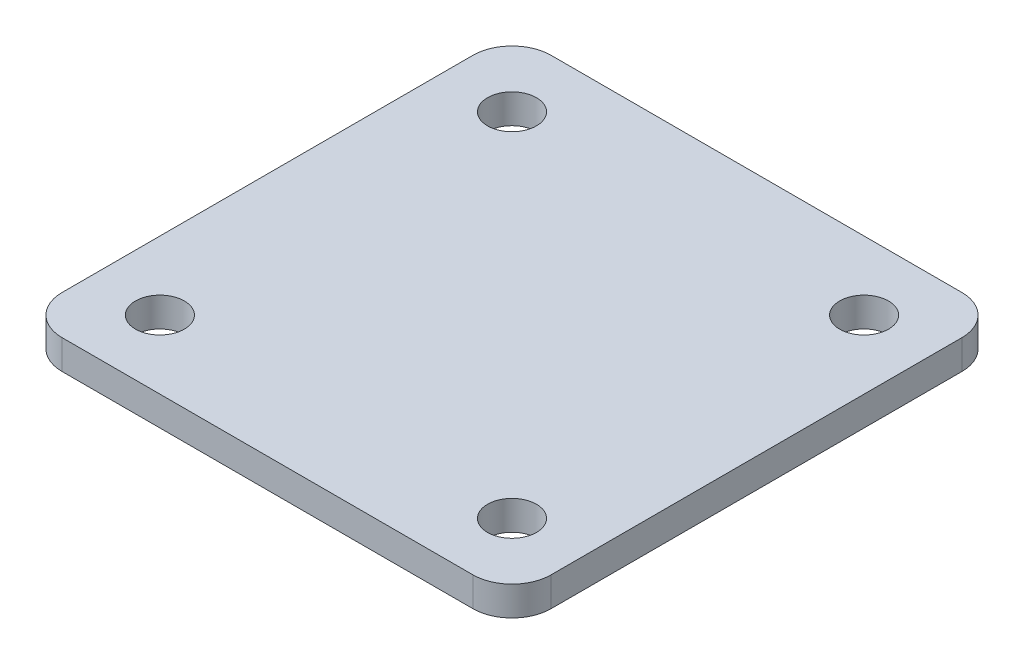
ISO-10303-21;
HEADER;
FILE_DESCRIPTION(('STEP AP214'),'2;1');
FILE_NAME('part.step','',(''),(''),'','','');
FILE_SCHEMA(('AUTOMOTIVE_DESIGN { 1 0 10303 214 1 1 1 1 }'));
ENDSEC;
DATA;
#1=APPLICATION_CONTEXT('core data for automotive mechanical design processes');
#2=APPLICATION_PROTOCOL_DEFINITION('international standard','automotive_design',2000,#1);
#3=PRODUCT_CONTEXT('',#1,'mechanical');
#4=PRODUCT('Part','Part','',(#3));
#5=PRODUCT_RELATED_PRODUCT_CATEGORY('part','',(#4));
#6=PRODUCT_DEFINITION_FORMATION('','',#4);
#7=PRODUCT_DEFINITION_CONTEXT('part definition',#1,'design');
#8=PRODUCT_DEFINITION('design','',#6,#7);
#9=PRODUCT_DEFINITION_SHAPE('','',#8);
#10=(LENGTH_UNIT() NAMED_UNIT(*) SI_UNIT(.MILLI.,.METRE.));
#11=(NAMED_UNIT(*) PLANE_ANGLE_UNIT() SI_UNIT($,.RADIAN.));
#12=(NAMED_UNIT(*) SI_UNIT($,.STERADIAN.) SOLID_ANGLE_UNIT());
#13=UNCERTAINTY_MEASURE_WITH_UNIT(LENGTH_MEASURE(1.E-05),#10,'distance_accuracy_value','');
#14=(GEOMETRIC_REPRESENTATION_CONTEXT(3) GLOBAL_UNCERTAINTY_ASSIGNED_CONTEXT((#13)) GLOBAL_UNIT_ASSIGNED_CONTEXT((#10,
#11,#12)) REPRESENTATION_CONTEXT('',''));
#15=CARTESIAN_POINT('',(0.,0.,0.));
#16=DIRECTION('',(0.,0.,1.));
#17=DIRECTION('',(1.,0.,0.));
#18=AXIS2_PLACEMENT_3D('',#15,#16,#17);
#19=CARTESIAN_POINT('',(25.,3.,-25.));
#20=DIRECTION('',(-1.,0.,0.));
#21=DIRECTION('',(0.,0.,1.));
#22=AXIS2_PLACEMENT_3D('',#19,#20,#21);
#23=PLANE('',#22);
#24=DIRECTION('',(0.,0.,-1.));
#25=VECTOR('',#24,1.);
#26=CARTESIAN_POINT('',(25.,0.,-25.));
#27=LINE('',#26,#25);
#28=CARTESIAN_POINT('',(25.,0.,21.));
#29=VERTEX_POINT('',#28);
#30=CARTESIAN_POINT('',(25.,0.,-21.));
#31=VERTEX_POINT('',#30);
#32=EDGE_CURVE('E157',#29,#31,#27,.T.);
#33=ORIENTED_EDGE('',*,*,#32,.T.);
#34=DIRECTION('',(0.,-1.,0.));
#35=VECTOR('',#34,1.);
#36=CARTESIAN_POINT('',(25.,3.,-21.));
#37=LINE('',#36,#35);
#38=CARTESIAN_POINT('',(25.,3.,-21.));
#39=VERTEX_POINT('',#38);
#40=EDGE_CURVE('E11',#31,#39,#37,.F.);
#41=ORIENTED_EDGE('',*,*,#40,.T.);
#42=DIRECTION('',(0.,0.,-1.));
#43=VECTOR('',#42,1.);
#44=CARTESIAN_POINT('',(25.,3.,-25.));
#45=LINE('',#44,#43);
#46=CARTESIAN_POINT('',(25.,3.,21.));
#47=VERTEX_POINT('',#46);
#48=EDGE_CURVE('E125',#47,#39,#45,.T.);
#49=ORIENTED_EDGE('',*,*,#48,.F.);
#50=DIRECTION('',(0.,-1.,0.));
#51=VECTOR('',#50,1.);
#52=CARTESIAN_POINT('',(25.,3.,21.));
#53=LINE('',#52,#51);
#54=EDGE_CURVE('E41',#47,#29,#53,.T.);
#55=ORIENTED_EDGE('',*,*,#54,.T.);
#56=EDGE_LOOP('',(#33,#41,#49,#55));
#57=FACE_BOUND('',#56,.T.);
#58=ADVANCED_FACE('F33',(#57),#23,.F.);
#59=CARTESIAN_POINT('',(-25.,3.,-25.));
#60=DIRECTION('',(0.,0.,1.));
#61=DIRECTION('',(1.,0.,0.));
#62=AXIS2_PLACEMENT_3D('',#59,#60,#61);
#63=PLANE('',#62);
#64=DIRECTION('',(-1.,0.,0.));
#65=VECTOR('',#64,1.);
#66=CARTESIAN_POINT('',(-25.,0.,-25.));
#67=LINE('',#66,#65);
#68=CARTESIAN_POINT('',(21.,0.,-25.));
#69=VERTEX_POINT('',#68);
#70=CARTESIAN_POINT('',(-21.,0.,-25.));
#71=VERTEX_POINT('',#70);
#72=EDGE_CURVE('E130',#69,#71,#67,.T.);
#73=ORIENTED_EDGE('',*,*,#72,.T.);
#74=DIRECTION('',(0.,-1.,0.));
#75=VECTOR('',#74,1.);
#76=CARTESIAN_POINT('',(-21.,3.,-25.));
#77=LINE('',#76,#75);
#78=CARTESIAN_POINT('',(-21.,3.,-25.));
#79=VERTEX_POINT('',#78);
#80=EDGE_CURVE('E48',#71,#79,#77,.F.);
#81=ORIENTED_EDGE('',*,*,#80,.T.);
#82=DIRECTION('',(-1.,0.,0.));
#83=VECTOR('',#82,1.);
#84=CARTESIAN_POINT('',(-25.,3.,-25.));
#85=LINE('',#84,#83);
#86=CARTESIAN_POINT('',(21.,3.,-25.));
#87=VERTEX_POINT('',#86);
#88=EDGE_CURVE('E128',#87,#79,#85,.T.);
#89=ORIENTED_EDGE('',*,*,#88,.F.);
#90=DIRECTION('',(0.,-1.,0.));
#91=VECTOR('',#90,1.);
#92=CARTESIAN_POINT('',(21.,3.,-25.));
#93=LINE('',#92,#91);
#94=EDGE_CURVE('E149',#87,#69,#93,.T.);
#95=ORIENTED_EDGE('',*,*,#94,.T.);
#96=EDGE_LOOP('',(#73,#81,#89,#95));
#97=FACE_BOUND('',#96,.T.);
#98=ADVANCED_FACE('F217',(#97),#63,.F.);
#99=CARTESIAN_POINT('',(-25.,3.,-25.));
#100=DIRECTION('',(1.,0.,0.));
#101=DIRECTION('',(0.,0.,-1.));
#102=AXIS2_PLACEMENT_3D('',#99,#100,#101);
#103=PLANE('',#102);
#104=DIRECTION('',(0.,0.,1.));
#105=VECTOR('',#104,1.);
#106=CARTESIAN_POINT('',(-25.,0.,-25.));
#107=LINE('',#106,#105);
#108=CARTESIAN_POINT('',(-25.,0.,-21.));
#109=VERTEX_POINT('',#108);
#110=CARTESIAN_POINT('',(-25.,0.,21.));
#111=VERTEX_POINT('',#110);
#112=EDGE_CURVE('E126',#109,#111,#107,.T.);
#113=ORIENTED_EDGE('',*,*,#112,.T.);
#114=DIRECTION('',(0.,-1.,0.));
#115=VECTOR('',#114,1.);
#116=CARTESIAN_POINT('',(-25.,3.,21.));
#117=LINE('',#116,#115);
#118=CARTESIAN_POINT('',(-25.,3.,21.));
#119=VERTEX_POINT('',#118);
#120=EDGE_CURVE('E104',#111,#119,#117,.F.);
#121=ORIENTED_EDGE('',*,*,#120,.T.);
#122=DIRECTION('',(0.,0.,1.));
#123=VECTOR('',#122,1.);
#124=CARTESIAN_POINT('',(-25.,3.,-25.));
#125=LINE('',#124,#123);
#126=CARTESIAN_POINT('',(-25.,3.,-21.));
#127=VERTEX_POINT('',#126);
#128=EDGE_CURVE('E169',#127,#119,#125,.T.);
#129=ORIENTED_EDGE('',*,*,#128,.F.);
#130=DIRECTION('',(0.,-1.,0.));
#131=VECTOR('',#130,1.);
#132=CARTESIAN_POINT('',(-25.,3.,-21.));
#133=LINE('',#132,#131);
#134=EDGE_CURVE('E109',#127,#109,#133,.T.);
#135=ORIENTED_EDGE('',*,*,#134,.T.);
#136=EDGE_LOOP('',(#113,#121,#129,#135));
#137=FACE_BOUND('',#136,.T.);
#138=ADVANCED_FACE('F214',(#137),#103,.F.);
#139=CARTESIAN_POINT('',(-25.,3.,25.));
#140=DIRECTION('',(0.,0.,-1.));
#141=DIRECTION('',(-1.,0.,0.));
#142=AXIS2_PLACEMENT_3D('',#139,#140,#141);
#143=PLANE('',#142);
#144=DIRECTION('',(1.,0.,0.));
#145=VECTOR('',#144,1.);
#146=CARTESIAN_POINT('',(-25.,3.,25.));
#147=LINE('',#146,#145);
#148=CARTESIAN_POINT('',(-21.,3.,25.));
#149=VERTEX_POINT('',#148);
#150=CARTESIAN_POINT('',(21.,3.,25.));
#151=VERTEX_POINT('',#150);
#152=EDGE_CURVE('E119',#149,#151,#147,.T.);
#153=ORIENTED_EDGE('',*,*,#152,.F.);
#154=DIRECTION('',(0.,-1.,0.));
#155=VECTOR('',#154,1.);
#156=CARTESIAN_POINT('',(-21.,3.,25.));
#157=LINE('',#156,#155);
#158=CARTESIAN_POINT('',(-21.,0.,25.));
#159=VERTEX_POINT('',#158);
#160=EDGE_CURVE('E103',#149,#159,#157,.T.);
#161=ORIENTED_EDGE('',*,*,#160,.T.);
#162=DIRECTION('',(1.,0.,0.));
#163=VECTOR('',#162,1.);
#164=CARTESIAN_POINT('',(-25.,0.,25.));
#165=LINE('',#164,#163);
#166=CARTESIAN_POINT('',(21.,0.,25.));
#167=VERTEX_POINT('',#166);
#168=EDGE_CURVE('E116',#159,#167,#165,.T.);
#169=ORIENTED_EDGE('',*,*,#168,.T.);
#170=DIRECTION('',(0.,-1.,0.));
#171=VECTOR('',#170,1.);
#172=CARTESIAN_POINT('',(21.,3.,25.));
#173=LINE('',#172,#171);
#174=EDGE_CURVE('E121',#167,#151,#173,.F.);
#175=ORIENTED_EDGE('',*,*,#174,.T.);
#176=EDGE_LOOP('',(#153,#161,#169,#175));
#177=FACE_BOUND('',#176,.T.);
#178=ADVANCED_FACE('F115',(#177),#143,.F.);
#179=CARTESIAN_POINT('',(0.,3.,0.));
#180=DIRECTION('',(0.,1.,0.));
#181=DIRECTION('',(0.,0.,1.));
#182=AXIS2_PLACEMENT_3D('',#179,#180,#181);
#183=PLANE('',#182);
#184=CARTESIAN_POINT('',(-18.,3.,18.));
#185=DIRECTION('',(0.,1.,0.));
#186=DIRECTION('',(0.,0.,1.));
#187=AXIS2_PLACEMENT_3D('',#184,#185,#186);
#188=CIRCLE('',#187,2.5);
#189=CARTESIAN_POINT('',(-18.,3.,20.5));
#190=VERTEX_POINT('',#189);
#191=EDGE_CURVE('E176',#190,#190,#188,.T.);
#192=ORIENTED_EDGE('',*,*,#191,.F.);
#193=EDGE_LOOP('',(#192));
#194=FACE_BOUND('',#193,.T.);
#195=CARTESIAN_POINT('',(18.,3.,18.));
#196=DIRECTION('',(0.,1.,0.));
#197=DIRECTION('',(0.,0.,1.));
#198=AXIS2_PLACEMENT_3D('',#195,#196,#197);
#199=CIRCLE('',#198,2.5);
#200=CARTESIAN_POINT('',(18.,3.,20.5));
#201=VERTEX_POINT('',#200);
#202=EDGE_CURVE('E182',#201,#201,#199,.T.);
#203=ORIENTED_EDGE('',*,*,#202,.F.);
#204=EDGE_LOOP('',(#203));
#205=FACE_BOUND('',#204,.T.);
#206=CARTESIAN_POINT('',(18.,3.,-18.));
#207=DIRECTION('',(0.,1.,0.));
#208=DIRECTION('',(0.,0.,1.));
#209=AXIS2_PLACEMENT_3D('',#206,#207,#208);
#210=CIRCLE('',#209,2.5);
#211=CARTESIAN_POINT('',(18.,3.,-15.5));
#212=VERTEX_POINT('',#211);
#213=EDGE_CURVE('E188',#212,#212,#210,.T.);
#214=ORIENTED_EDGE('',*,*,#213,.F.);
#215=EDGE_LOOP('',(#214));
#216=FACE_BOUND('',#215,.T.);
#217=CARTESIAN_POINT('',(-18.,3.,-18.));
#218=DIRECTION('',(0.,1.,0.));
#219=DIRECTION('',(0.,0.,1.));
#220=AXIS2_PLACEMENT_3D('',#217,#218,#219);
#221=CIRCLE('',#220,2.5);
#222=CARTESIAN_POINT('',(-18.,3.,-15.5));
#223=VERTEX_POINT('',#222);
#224=EDGE_CURVE('E165',#223,#223,#221,.T.);
#225=ORIENTED_EDGE('',*,*,#224,.F.);
#226=EDGE_LOOP('',(#225));
#227=FACE_BOUND('',#226,.T.);
#228=ORIENTED_EDGE('',*,*,#128,.T.);
#229=CARTESIAN_POINT('',(-21.,3.,21.));
#230=DIRECTION('',(0.,1.,0.));
#231=DIRECTION('',(0.,0.,1.));
#232=AXIS2_PLACEMENT_3D('',#229,#230,#231);
#233=CIRCLE('',#232,4.);
#234=EDGE_CURVE('E147',#119,#149,#233,.T.);
#235=ORIENTED_EDGE('',*,*,#234,.T.);
#236=ORIENTED_EDGE('',*,*,#152,.T.);
#237=CARTESIAN_POINT('',(21.,3.,21.));
#238=DIRECTION('',(0.,1.,0.));
#239=DIRECTION('',(0.,0.,1.));
#240=AXIS2_PLACEMENT_3D('',#237,#238,#239);
#241=CIRCLE('',#240,4.);
#242=EDGE_CURVE('E142',#151,#47,#241,.T.);
#243=ORIENTED_EDGE('',*,*,#242,.T.);
#244=ORIENTED_EDGE('',*,*,#48,.T.);
#245=CARTESIAN_POINT('',(21.,3.,-21.));
#246=DIRECTION('',(0.,1.,0.));
#247=DIRECTION('',(0.,0.,1.));
#248=AXIS2_PLACEMENT_3D('',#245,#246,#247);
#249=CIRCLE('',#248,4.);
#250=EDGE_CURVE('E55',#39,#87,#249,.T.);
#251=ORIENTED_EDGE('',*,*,#250,.T.);
#252=ORIENTED_EDGE('',*,*,#88,.T.);
#253=CARTESIAN_POINT('',(-21.,3.,-21.));
#254=DIRECTION('',(0.,1.,0.));
#255=DIRECTION('',(0.,0.,1.));
#256=AXIS2_PLACEMENT_3D('',#253,#254,#255);
#257=CIRCLE('',#256,4.);
#258=EDGE_CURVE('E145',#79,#127,#257,.T.);
#259=ORIENTED_EDGE('',*,*,#258,.T.);
#260=EDGE_LOOP('',(#228,#235,#236,#243,#244,#251,#252,#259));
#261=FACE_BOUND('',#260,.T.);
#262=ADVANCED_FACE('F204',(#194,#205,#216,#227,#261),#183,.T.);
#263=CARTESIAN_POINT('',(0.,0.,0.));
#264=DIRECTION('',(0.,1.,0.));
#265=DIRECTION('',(0.,0.,1.));
#266=AXIS2_PLACEMENT_3D('',#263,#264,#265);
#267=PLANE('',#266);
#268=CARTESIAN_POINT('',(-18.,0.,18.));
#269=DIRECTION('',(0.,1.,0.));
#270=DIRECTION('',(0.,0.,1.));
#271=AXIS2_PLACEMENT_3D('',#268,#269,#270);
#272=CIRCLE('',#271,2.5);
#273=CARTESIAN_POINT('',(-18.,0.,20.5));
#274=VERTEX_POINT('',#273);
#275=EDGE_CURVE('E179',#274,#274,#272,.T.);
#276=ORIENTED_EDGE('',*,*,#275,.T.);
#277=EDGE_LOOP('',(#276));
#278=FACE_BOUND('',#277,.T.);
#279=CARTESIAN_POINT('',(18.,0.,18.));
#280=DIRECTION('',(0.,1.,0.));
#281=DIRECTION('',(0.,0.,1.));
#282=AXIS2_PLACEMENT_3D('',#279,#280,#281);
#283=CIRCLE('',#282,2.5);
#284=CARTESIAN_POINT('',(18.,0.,20.5));
#285=VERTEX_POINT('',#284);
#286=EDGE_CURVE('E185',#285,#285,#283,.T.);
#287=ORIENTED_EDGE('',*,*,#286,.T.);
#288=EDGE_LOOP('',(#287));
#289=FACE_BOUND('',#288,.T.);
#290=CARTESIAN_POINT('',(18.,0.,-18.));
#291=DIRECTION('',(0.,1.,0.));
#292=DIRECTION('',(0.,0.,1.));
#293=AXIS2_PLACEMENT_3D('',#290,#291,#292);
#294=CIRCLE('',#293,2.5);
#295=CARTESIAN_POINT('',(18.,0.,-15.5));
#296=VERTEX_POINT('',#295);
#297=EDGE_CURVE('E174',#296,#296,#294,.T.);
#298=ORIENTED_EDGE('',*,*,#297,.T.);
#299=EDGE_LOOP('',(#298));
#300=FACE_BOUND('',#299,.T.);
#301=CARTESIAN_POINT('',(-18.,0.,-18.));
#302=DIRECTION('',(0.,1.,0.));
#303=DIRECTION('',(0.,0.,1.));
#304=AXIS2_PLACEMENT_3D('',#301,#302,#303);
#305=CIRCLE('',#304,2.5);
#306=CARTESIAN_POINT('',(-18.,0.,-15.5));
#307=VERTEX_POINT('',#306);
#308=EDGE_CURVE('E162',#307,#307,#305,.T.);
#309=ORIENTED_EDGE('',*,*,#308,.T.);
#310=EDGE_LOOP('',(#309));
#311=FACE_BOUND('',#310,.T.);
#312=ORIENTED_EDGE('',*,*,#168,.F.);
#313=CARTESIAN_POINT('',(-21.,0.,21.));
#314=DIRECTION('',(0.,1.,0.));
#315=DIRECTION('',(0.,0.,1.));
#316=AXIS2_PLACEMENT_3D('',#313,#314,#315);
#317=CIRCLE('',#316,4.);
#318=EDGE_CURVE('E99',#159,#111,#317,.F.);
#319=ORIENTED_EDGE('',*,*,#318,.T.);
#320=ORIENTED_EDGE('',*,*,#112,.F.);
#321=CARTESIAN_POINT('',(-21.,0.,-21.));
#322=DIRECTION('',(0.,1.,0.));
#323=DIRECTION('',(0.,0.,1.));
#324=AXIS2_PLACEMENT_3D('',#321,#322,#323);
#325=CIRCLE('',#324,4.);
#326=EDGE_CURVE('E110',#109,#71,#325,.F.);
#327=ORIENTED_EDGE('',*,*,#326,.T.);
#328=ORIENTED_EDGE('',*,*,#72,.F.);
#329=CARTESIAN_POINT('',(21.,0.,-21.));
#330=DIRECTION('',(0.,1.,0.));
#331=DIRECTION('',(0.,0.,1.));
#332=AXIS2_PLACEMENT_3D('',#329,#330,#331);
#333=CIRCLE('',#332,4.);
#334=EDGE_CURVE('E136',#69,#31,#333,.F.);
#335=ORIENTED_EDGE('',*,*,#334,.T.);
#336=ORIENTED_EDGE('',*,*,#32,.F.);
#337=CARTESIAN_POINT('',(21.,0.,21.));
#338=DIRECTION('',(0.,1.,0.));
#339=DIRECTION('',(0.,0.,1.));
#340=AXIS2_PLACEMENT_3D('',#337,#338,#339);
#341=CIRCLE('',#340,4.);
#342=EDGE_CURVE('E120',#29,#167,#341,.F.);
#343=ORIENTED_EDGE('',*,*,#342,.T.);
#344=EDGE_LOOP('',(#312,#319,#320,#327,#328,#335,#336,#343));
#345=FACE_BOUND('',#344,.T.);
#346=ADVANCED_FACE('F123',(#278,#289,#300,#311,#345),#267,.F.);
#347=CARTESIAN_POINT('',(-21.,3.,21.));
#348=DIRECTION('',(0.,-1.,0.));
#349=DIRECTION('',(0.,0.,-1.));
#350=AXIS2_PLACEMENT_3D('',#347,#348,#349);
#351=CYLINDRICAL_SURFACE('',#350,4.);
#352=ORIENTED_EDGE('',*,*,#234,.F.);
#353=ORIENTED_EDGE('',*,*,#120,.F.);
#354=ORIENTED_EDGE('',*,*,#318,.F.);
#355=ORIENTED_EDGE('',*,*,#160,.F.);
#356=EDGE_LOOP('',(#352,#353,#354,#355));
#357=FACE_BOUND('',#356,.T.);
#358=ADVANCED_FACE('F102',(#357),#351,.T.);
#359=CARTESIAN_POINT('',(-21.,3.,-21.));
#360=DIRECTION('',(0.,-1.,0.));
#361=DIRECTION('',(0.,0.,-1.));
#362=AXIS2_PLACEMENT_3D('',#359,#360,#361);
#363=CYLINDRICAL_SURFACE('',#362,4.);
#364=ORIENTED_EDGE('',*,*,#258,.F.);
#365=ORIENTED_EDGE('',*,*,#80,.F.);
#366=ORIENTED_EDGE('',*,*,#326,.F.);
#367=ORIENTED_EDGE('',*,*,#134,.F.);
#368=EDGE_LOOP('',(#364,#365,#366,#367));
#369=FACE_BOUND('',#368,.T.);
#370=ADVANCED_FACE('F216',(#369),#363,.T.);
#371=CARTESIAN_POINT('',(21.,3.,-21.));
#372=DIRECTION('',(0.,-1.,0.));
#373=DIRECTION('',(0.,0.,-1.));
#374=AXIS2_PLACEMENT_3D('',#371,#372,#373);
#375=CYLINDRICAL_SURFACE('',#374,4.);
#376=ORIENTED_EDGE('',*,*,#250,.F.);
#377=ORIENTED_EDGE('',*,*,#40,.F.);
#378=ORIENTED_EDGE('',*,*,#334,.F.);
#379=ORIENTED_EDGE('',*,*,#94,.F.);
#380=EDGE_LOOP('',(#376,#377,#378,#379));
#381=FACE_BOUND('',#380,.T.);
#382=ADVANCED_FACE('F220',(#381),#375,.T.);
#383=CARTESIAN_POINT('',(21.,3.,21.));
#384=DIRECTION('',(0.,-1.,0.));
#385=DIRECTION('',(0.,0.,-1.));
#386=AXIS2_PLACEMENT_3D('',#383,#384,#385);
#387=CYLINDRICAL_SURFACE('',#386,4.);
#388=ORIENTED_EDGE('',*,*,#242,.F.);
#389=ORIENTED_EDGE('',*,*,#174,.F.);
#390=ORIENTED_EDGE('',*,*,#342,.F.);
#391=ORIENTED_EDGE('',*,*,#54,.F.);
#392=EDGE_LOOP('',(#388,#389,#390,#391));
#393=FACE_BOUND('',#392,.T.);
#394=ADVANCED_FACE('F35',(#393),#387,.T.);
#395=CARTESIAN_POINT('',(-18.,0.,-18.));
#396=DIRECTION('',(0.,1.,0.));
#397=DIRECTION('',(0.,0.,1.));
#398=AXIS2_PLACEMENT_3D('',#395,#396,#397);
#399=CYLINDRICAL_SURFACE('',#398,2.5);
#400=ORIENTED_EDGE('',*,*,#308,.F.);
#401=EDGE_LOOP('',(#400));
#402=FACE_BOUND('',#401,.T.);
#403=ORIENTED_EDGE('',*,*,#224,.T.);
#404=EDGE_LOOP('',(#403));
#405=FACE_BOUND('',#404,.T.);
#406=ADVANCED_FACE('F200',(#402,#405),#399,.F.);
#407=CARTESIAN_POINT('',(18.,0.,-18.));
#408=DIRECTION('',(0.,1.,0.));
#409=DIRECTION('',(0.,0.,1.));
#410=AXIS2_PLACEMENT_3D('',#407,#408,#409);
#411=CYLINDRICAL_SURFACE('',#410,2.5);
#412=ORIENTED_EDGE('',*,*,#297,.F.);
#413=EDGE_LOOP('',(#412));
#414=FACE_BOUND('',#413,.T.);
#415=ORIENTED_EDGE('',*,*,#213,.T.);
#416=EDGE_LOOP('',(#415));
#417=FACE_BOUND('',#416,.T.);
#418=ADVANCED_FACE('F196',(#414,#417),#411,.F.);
#419=CARTESIAN_POINT('',(18.,0.,18.));
#420=DIRECTION('',(0.,1.,0.));
#421=DIRECTION('',(0.,0.,1.));
#422=AXIS2_PLACEMENT_3D('',#419,#420,#421);
#423=CYLINDRICAL_SURFACE('',#422,2.5);
#424=ORIENTED_EDGE('',*,*,#286,.F.);
#425=EDGE_LOOP('',(#424));
#426=FACE_BOUND('',#425,.T.);
#427=ORIENTED_EDGE('',*,*,#202,.T.);
#428=EDGE_LOOP('',(#427));
#429=FACE_BOUND('',#428,.T.);
#430=ADVANCED_FACE('F199',(#426,#429),#423,.F.);
#431=CARTESIAN_POINT('',(-18.,0.,18.));
#432=DIRECTION('',(0.,1.,0.));
#433=DIRECTION('',(0.,0.,1.));
#434=AXIS2_PLACEMENT_3D('',#431,#432,#433);
#435=CYLINDRICAL_SURFACE('',#434,2.5);
#436=ORIENTED_EDGE('',*,*,#275,.F.);
#437=EDGE_LOOP('',(#436));
#438=FACE_BOUND('',#437,.T.);
#439=ORIENTED_EDGE('',*,*,#191,.T.);
#440=EDGE_LOOP('',(#439));
#441=FACE_BOUND('',#440,.T.);
#442=ADVANCED_FACE('F284',(#438,#441),#435,.F.);
#443=CLOSED_SHELL('',(#58,#98,#138,#178,#262,#346,#358,#370,#382,#394,#406,#418,#430,#442));
#444=MANIFOLD_SOLID_BREP('B2',#443);
#445=ADVANCED_BREP_SHAPE_REPRESENTATION('',(#18,#444),#14);
#446=SHAPE_DEFINITION_REPRESENTATION(#9,#445);
ENDSEC;
END-ISO-10303-21;
